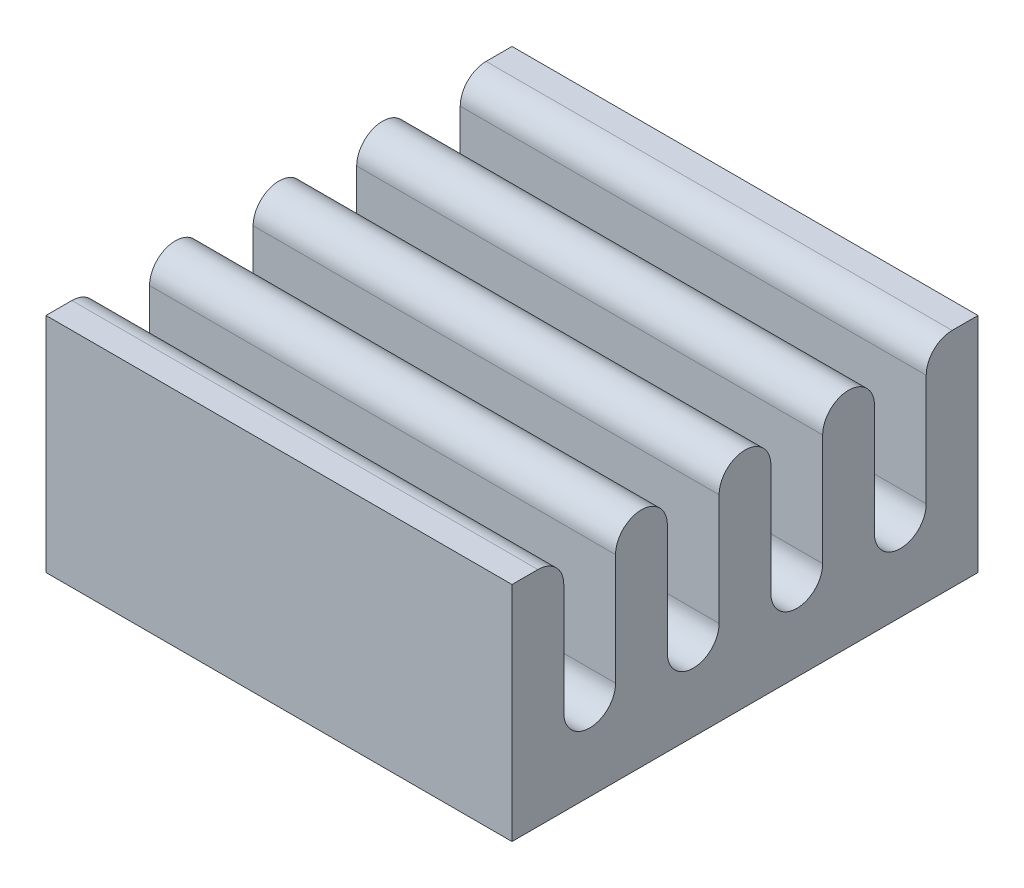
ISO-10303-21;
HEADER;
FILE_DESCRIPTION(('STEP AP214'),'2;1');
FILE_NAME('part.step','',(''),(''),'','','');
FILE_SCHEMA(('AUTOMOTIVE_DESIGN { 1 0 10303 214 1 1 1 1 }'));
ENDSEC;
DATA;
#1=APPLICATION_CONTEXT('core data for automotive mechanical design processes');
#2=APPLICATION_PROTOCOL_DEFINITION('international standard','automotive_design',2000,#1);
#3=PRODUCT_CONTEXT('',#1,'mechanical');
#4=PRODUCT('Part','Part','',(#3));
#5=PRODUCT_RELATED_PRODUCT_CATEGORY('part','',(#4));
#6=PRODUCT_DEFINITION_FORMATION('','',#4);
#7=PRODUCT_DEFINITION_CONTEXT('part definition',#1,'design');
#8=PRODUCT_DEFINITION('design','',#6,#7);
#9=PRODUCT_DEFINITION_SHAPE('','',#8);
#10=(LENGTH_UNIT() NAMED_UNIT(*) SI_UNIT(.MILLI.,.METRE.));
#11=(NAMED_UNIT(*) PLANE_ANGLE_UNIT() SI_UNIT($,.RADIAN.));
#12=(NAMED_UNIT(*) SI_UNIT($,.STERADIAN.) SOLID_ANGLE_UNIT());
#13=UNCERTAINTY_MEASURE_WITH_UNIT(LENGTH_MEASURE(1.E-05),#10,'distance_accuracy_value','');
#14=(GEOMETRIC_REPRESENTATION_CONTEXT(3) GLOBAL_UNCERTAINTY_ASSIGNED_CONTEXT((#13)) GLOBAL_UNIT_ASSIGNED_CONTEXT((#10,
#11,#12)) REPRESENTATION_CONTEXT('',''));
#15=CARTESIAN_POINT('',(0.,0.,0.));
#16=DIRECTION('',(0.,0.,1.));
#17=DIRECTION('',(1.,0.,0.));
#18=AXIS2_PLACEMENT_3D('',#15,#16,#17);
#19=CARTESIAN_POINT('',(-5.40120000000004,5.7,-7.55154555423788));
#20=DIRECTION('',(-1.,0.,0.));
#21=DIRECTION('',(0.,-1.,0.));
#22=AXIS2_PLACEMENT_3D('',#19,#20,#21);
#23=CYLINDRICAL_SURFACE('',#22,0.500000000000003);
#24=CARTESIAN_POINT('',(-4.50000000000004,5.7,-7.55154555423788));
#25=DIRECTION('',(-1.,0.,0.));
#26=DIRECTION('',(0.,-1.,0.));
#27=AXIS2_PLACEMENT_3D('',#24,#25,#26);
#28=CIRCLE('',#27,0.500000000000003);
#29=CARTESIAN_POINT('',(-4.50000000000004,6.2,-7.55154555423788));
#30=VERTEX_POINT('',#29);
#31=CARTESIAN_POINT('',(-4.50000000000004,5.7,-7.05154555423787));
#32=VERTEX_POINT('',#31);
#33=EDGE_CURVE('E172',#30,#32,#28,.F.);
#34=ORIENTED_EDGE('',*,*,#33,.T.);
#35=DIRECTION('',(1.,0.,0.));
#36=VECTOR('',#35,1.);
#37=CARTESIAN_POINT('',(5.40119999999996,5.7,-7.05154555423787));
#38=LINE('',#37,#36);
#39=CARTESIAN_POINT('',(4.49999999999996,5.7,-7.05154555423787));
#40=VERTEX_POINT('',#39);
#41=EDGE_CURVE('E174',#40,#32,#38,.F.);
#42=ORIENTED_EDGE('',*,*,#41,.F.);
#43=CARTESIAN_POINT('',(4.49999999999996,5.7,-7.55154555423788));
#44=DIRECTION('',(-1.,0.,0.));
#45=DIRECTION('',(0.,-1.,0.));
#46=AXIS2_PLACEMENT_3D('',#43,#44,#45);
#47=CIRCLE('',#46,0.500000000000003);
#48=CARTESIAN_POINT('',(4.49999999999996,6.2,-7.55154555423788));
#49=VERTEX_POINT('',#48);
#50=EDGE_CURVE('E20',#40,#49,#47,.T.);
#51=ORIENTED_EDGE('',*,*,#50,.T.);
#52=DIRECTION('',(-1.,0.,0.));
#53=VECTOR('',#52,1.);
#54=CARTESIAN_POINT('',(5.40119999999996,6.2,-7.55154555423787));
#55=LINE('',#54,#53);
#56=EDGE_CURVE('E282',#30,#49,#55,.F.);
#57=ORIENTED_EDGE('',*,*,#56,.F.);
#58=EDGE_LOOP('',(#34,#42,#51,#57));
#59=FACE_BOUND('',#58,.T.);
#60=ADVANCED_FACE('F17',(#59),#23,.T.);
#61=CARTESIAN_POINT('',(0.,3.55000000000001,-6.55154555423787));
#62=DIRECTION('',(1.,0.,0.));
#63=DIRECTION('',(0.,1.,0.));
#64=AXIS2_PLACEMENT_3D('',#61,#62,#63);
#65=CYLINDRICAL_SURFACE('',#64,0.500000000000003);
#66=DIRECTION('',(1.,0.,0.));
#67=VECTOR('',#66,1.);
#68=CARTESIAN_POINT('',(5.40119999999996,3.55000000000001,-7.05154555423787));
#69=LINE('',#68,#67);
#70=CARTESIAN_POINT('',(-4.50000000000004,3.55000000000001,-7.05154555423787));
#71=VERTEX_POINT('',#70);
#72=CARTESIAN_POINT('',(4.49999999999996,3.55000000000001,-7.05154555423787));
#73=VERTEX_POINT('',#72);
#74=EDGE_CURVE('E179',#71,#73,#69,.T.);
#75=ORIENTED_EDGE('',*,*,#74,.F.);
#76=CARTESIAN_POINT('',(-4.50000000000004,3.55000000000001,-6.55154555423787));
#77=DIRECTION('',(1.,0.,0.));
#78=DIRECTION('',(0.,1.,0.));
#79=AXIS2_PLACEMENT_3D('',#76,#77,#78);
#80=CIRCLE('',#79,0.500000000000003);
#81=CARTESIAN_POINT('',(-4.50000000000004,3.55000000000001,-6.05154555423787));
#82=VERTEX_POINT('',#81);
#83=EDGE_CURVE('E332',#82,#71,#80,.T.);
#84=ORIENTED_EDGE('',*,*,#83,.F.);
#85=DIRECTION('',(1.,0.,0.));
#86=VECTOR('',#85,1.);
#87=CARTESIAN_POINT('',(-5.40120000000004,3.55000000000001,-6.05154555423787));
#88=LINE('',#87,#86);
#89=CARTESIAN_POINT('',(4.49999999999996,3.55000000000001,-6.05154555423787));
#90=VERTEX_POINT('',#89);
#91=EDGE_CURVE('E178',#90,#82,#88,.F.);
#92=ORIENTED_EDGE('',*,*,#91,.F.);
#93=CARTESIAN_POINT('',(4.49999999999996,3.55000000000001,-6.55154555423787));
#94=DIRECTION('',(1.,0.,0.));
#95=DIRECTION('',(0.,1.,0.));
#96=AXIS2_PLACEMENT_3D('',#93,#94,#95);
#97=CIRCLE('',#96,0.500000000000003);
#98=EDGE_CURVE('E330',#73,#90,#97,.F.);
#99=ORIENTED_EDGE('',*,*,#98,.F.);
#100=EDGE_LOOP('',(#75,#84,#92,#99));
#101=FACE_BOUND('',#100,.T.);
#102=ADVANCED_FACE('F338',(#101),#65,.F.);
#103=CARTESIAN_POINT('',(-5.40120000000004,5.7,-5.55154555423787));
#104=DIRECTION('',(-1.,0.,0.));
#105=DIRECTION('',(0.,-1.,0.));
#106=AXIS2_PLACEMENT_3D('',#103,#104,#105);
#107=CYLINDRICAL_SURFACE('',#106,0.500000000000007);
#108=CARTESIAN_POINT('',(-4.50000000000004,5.7,-5.55154555423787));
#109=DIRECTION('',(-1.,0.,0.));
#110=DIRECTION('',(0.,-1.,0.));
#111=AXIS2_PLACEMENT_3D('',#108,#109,#110);
#112=CIRCLE('',#111,0.500000000000007);
#113=CARTESIAN_POINT('',(-4.50000000000004,5.7,-6.05154555423787));
#114=VERTEX_POINT('',#113);
#115=CARTESIAN_POINT('',(-4.50000000000004,5.7,-5.05154555423787));
#116=VERTEX_POINT('',#115);
#117=EDGE_CURVE('E326',#114,#116,#112,.F.);
#118=ORIENTED_EDGE('',*,*,#117,.T.);
#119=DIRECTION('',(1.,0.,0.));
#120=VECTOR('',#119,1.);
#121=CARTESIAN_POINT('',(5.40119999999996,5.7,-5.05154555423787));
#122=LINE('',#121,#120);
#123=CARTESIAN_POINT('',(4.49999999999996,5.7,-5.05154555423787));
#124=VERTEX_POINT('',#123);
#125=EDGE_CURVE('E268',#124,#116,#122,.F.);
#126=ORIENTED_EDGE('',*,*,#125,.F.);
#127=CARTESIAN_POINT('',(4.49999999999996,5.7,-5.55154555423787));
#128=DIRECTION('',(-1.,0.,0.));
#129=DIRECTION('',(0.,-1.,0.));
#130=AXIS2_PLACEMENT_3D('',#127,#128,#129);
#131=CIRCLE('',#130,0.500000000000007);
#132=CARTESIAN_POINT('',(4.49999999999996,5.7,-6.05154555423787));
#133=VERTEX_POINT('',#132);
#134=EDGE_CURVE('E328',#124,#133,#131,.T.);
#135=ORIENTED_EDGE('',*,*,#134,.T.);
#136=DIRECTION('',(1.,0.,0.));
#137=VECTOR('',#136,1.);
#138=CARTESIAN_POINT('',(-5.40120000000004,5.7,-6.05154555423787));
#139=LINE('',#138,#137);
#140=EDGE_CURVE('E276',#114,#133,#139,.T.);
#141=ORIENTED_EDGE('',*,*,#140,.F.);
#142=EDGE_LOOP('',(#118,#126,#135,#141));
#143=FACE_BOUND('',#142,.T.);
#144=ADVANCED_FACE('F346',(#143),#107,.T.);
#145=CARTESIAN_POINT('',(0.,3.55000000000001,-4.55154555423787));
#146=DIRECTION('',(1.,0.,0.));
#147=DIRECTION('',(0.,1.,0.));
#148=AXIS2_PLACEMENT_3D('',#145,#146,#147);
#149=CYLINDRICAL_SURFACE('',#148,0.500000000000003);
#150=DIRECTION('',(1.,0.,0.));
#151=VECTOR('',#150,1.);
#152=CARTESIAN_POINT('',(5.40119999999996,3.55000000000001,-5.05154555423787));
#153=LINE('',#152,#151);
#154=CARTESIAN_POINT('',(-4.50000000000004,3.55000000000001,-5.05154555423787));
#155=VERTEX_POINT('',#154);
#156=CARTESIAN_POINT('',(4.49999999999996,3.55000000000001,-5.05154555423787));
#157=VERTEX_POINT('',#156);
#158=EDGE_CURVE('E273',#155,#157,#153,.T.);
#159=ORIENTED_EDGE('',*,*,#158,.F.);
#160=CARTESIAN_POINT('',(-4.50000000000004,3.55000000000001,-4.55154555423787));
#161=DIRECTION('',(1.,0.,0.));
#162=DIRECTION('',(0.,1.,0.));
#163=AXIS2_PLACEMENT_3D('',#160,#161,#162);
#164=CIRCLE('',#163,0.500000000000003);
#165=CARTESIAN_POINT('',(-4.50000000000004,3.55000000000001,-4.05154555423787));
#166=VERTEX_POINT('',#165);
#167=EDGE_CURVE('E324',#166,#155,#164,.T.);
#168=ORIENTED_EDGE('',*,*,#167,.F.);
#169=DIRECTION('',(1.,0.,0.));
#170=VECTOR('',#169,1.);
#171=CARTESIAN_POINT('',(-5.40120000000004,3.55000000000001,-4.05154555423787));
#172=LINE('',#171,#170);
#173=CARTESIAN_POINT('',(4.49999999999996,3.55000000000001,-4.05154555423787));
#174=VERTEX_POINT('',#173);
#175=EDGE_CURVE('E265',#174,#166,#172,.F.);
#176=ORIENTED_EDGE('',*,*,#175,.F.);
#177=CARTESIAN_POINT('',(4.49999999999996,3.55000000000001,-4.55154555423787));
#178=DIRECTION('',(1.,0.,0.));
#179=DIRECTION('',(0.,1.,0.));
#180=AXIS2_PLACEMENT_3D('',#177,#178,#179);
#181=CIRCLE('',#180,0.500000000000003);
#182=EDGE_CURVE('E322',#157,#174,#181,.F.);
#183=ORIENTED_EDGE('',*,*,#182,.F.);
#184=EDGE_LOOP('',(#159,#168,#176,#183));
#185=FACE_BOUND('',#184,.T.);
#186=ADVANCED_FACE('F435',(#185),#149,.F.);
#187=CARTESIAN_POINT('',(-5.40120000000004,5.7,-3.55154555423788));
#188=DIRECTION('',(-1.,0.,0.));
#189=DIRECTION('',(0.,-1.,0.));
#190=AXIS2_PLACEMENT_3D('',#187,#188,#189);
#191=CYLINDRICAL_SURFACE('',#190,0.500000000000003);
#192=CARTESIAN_POINT('',(-4.50000000000004,5.7,-3.55154555423788));
#193=DIRECTION('',(-1.,0.,0.));
#194=DIRECTION('',(0.,-1.,0.));
#195=AXIS2_PLACEMENT_3D('',#192,#193,#194);
#196=CIRCLE('',#195,0.500000000000003);
#197=CARTESIAN_POINT('',(-4.50000000000004,5.7,-4.05154555423787));
#198=VERTEX_POINT('',#197);
#199=CARTESIAN_POINT('',(-4.50000000000004,5.7,-3.05154555423787));
#200=VERTEX_POINT('',#199);
#201=EDGE_CURVE('E318',#198,#200,#196,.F.);
#202=ORIENTED_EDGE('',*,*,#201,.T.);
#203=DIRECTION('',(1.,0.,0.));
#204=VECTOR('',#203,1.);
#205=CARTESIAN_POINT('',(5.40119999999996,5.7,-3.05154555423787));
#206=LINE('',#205,#204);
#207=CARTESIAN_POINT('',(4.49999999999996,5.7,-3.05154555423787));
#208=VERTEX_POINT('',#207);
#209=EDGE_CURVE('E256',#208,#200,#206,.F.);
#210=ORIENTED_EDGE('',*,*,#209,.F.);
#211=CARTESIAN_POINT('',(4.49999999999996,5.7,-3.55154555423788));
#212=DIRECTION('',(-1.,0.,0.));
#213=DIRECTION('',(0.,-1.,0.));
#214=AXIS2_PLACEMENT_3D('',#211,#212,#213);
#215=CIRCLE('',#214,0.500000000000003);
#216=CARTESIAN_POINT('',(4.49999999999996,5.7,-4.05154555423787));
#217=VERTEX_POINT('',#216);
#218=EDGE_CURVE('E320',#208,#217,#215,.T.);
#219=ORIENTED_EDGE('',*,*,#218,.T.);
#220=DIRECTION('',(1.,0.,0.));
#221=VECTOR('',#220,1.);
#222=CARTESIAN_POINT('',(-5.40120000000004,5.7,-4.05154555423787));
#223=LINE('',#222,#221);
#224=EDGE_CURVE('E264',#198,#217,#223,.T.);
#225=ORIENTED_EDGE('',*,*,#224,.F.);
#226=EDGE_LOOP('',(#202,#210,#219,#225));
#227=FACE_BOUND('',#226,.T.);
#228=ADVANCED_FACE('F427',(#227),#191,.T.);
#229=CARTESIAN_POINT('',(0.,3.55000000000001,-2.55154555423789));
#230=DIRECTION('',(1.,0.,0.));
#231=DIRECTION('',(0.,1.,0.));
#232=AXIS2_PLACEMENT_3D('',#229,#230,#231);
#233=CYLINDRICAL_SURFACE('',#232,0.50000000000002);
#234=DIRECTION('',(1.,0.,0.));
#235=VECTOR('',#234,1.);
#236=CARTESIAN_POINT('',(5.40119999999996,3.55000000000001,-3.05154555423787));
#237=LINE('',#236,#235);
#238=CARTESIAN_POINT('',(-4.50000000000004,3.55000000000002,-3.05154555423787));
#239=VERTEX_POINT('',#238);
#240=CARTESIAN_POINT('',(4.49999999999996,3.55,-3.05154555423787));
#241=VERTEX_POINT('',#240);
#242=EDGE_CURVE('E261',#239,#241,#237,.T.);
#243=ORIENTED_EDGE('',*,*,#242,.F.);
#244=CARTESIAN_POINT('',(-4.50000000000004,3.55000000000003,-2.55154555423789));
#245=DIRECTION('',(1.,0.,0.));
#246=DIRECTION('',(0.,1.,0.));
#247=AXIS2_PLACEMENT_3D('',#244,#245,#246);
#248=CIRCLE('',#247,0.50000000000002);
#249=CARTESIAN_POINT('',(-4.50000000000004,3.55000000000002,-2.05154555423787));
#250=VERTEX_POINT('',#249);
#251=EDGE_CURVE('E316',#250,#239,#248,.T.);
#252=ORIENTED_EDGE('',*,*,#251,.F.);
#253=DIRECTION('',(1.,0.,0.));
#254=VECTOR('',#253,1.);
#255=CARTESIAN_POINT('',(-5.40120000000004,3.55000000000001,-2.05154555423787));
#256=LINE('',#255,#254);
#257=CARTESIAN_POINT('',(4.49999999999996,3.55,-2.05154555423787));
#258=VERTEX_POINT('',#257);
#259=EDGE_CURVE('E253',#258,#250,#256,.F.);
#260=ORIENTED_EDGE('',*,*,#259,.F.);
#261=CARTESIAN_POINT('',(4.49999999999996,3.54999999999999,-2.55154555423789));
#262=DIRECTION('',(1.,0.,0.));
#263=DIRECTION('',(0.,1.,0.));
#264=AXIS2_PLACEMENT_3D('',#261,#262,#263);
#265=CIRCLE('',#264,0.50000000000002);
#266=EDGE_CURVE('E314',#241,#258,#265,.F.);
#267=ORIENTED_EDGE('',*,*,#266,.F.);
#268=EDGE_LOOP('',(#243,#252,#260,#267));
#269=FACE_BOUND('',#268,.T.);
#270=ADVANCED_FACE('F421',(#269),#233,.F.);
#271=CARTESIAN_POINT('',(-5.40120000000004,5.7,-1.55154555423787));
#272=DIRECTION('',(-1.,0.,0.));
#273=DIRECTION('',(0.,-1.,0.));
#274=AXIS2_PLACEMENT_3D('',#271,#272,#273);
#275=CYLINDRICAL_SURFACE('',#274,0.499999999999998);
#276=CARTESIAN_POINT('',(-4.50000000000004,5.7,-1.55154555423787));
#277=DIRECTION('',(-1.,0.,0.));
#278=DIRECTION('',(0.,-1.,0.));
#279=AXIS2_PLACEMENT_3D('',#276,#277,#278);
#280=CIRCLE('',#279,0.499999999999998);
#281=CARTESIAN_POINT('',(-4.50000000000004,5.7,-2.05154555423787));
#282=VERTEX_POINT('',#281);
#283=CARTESIAN_POINT('',(-4.50000000000004,5.7,-1.05154555423787));
#284=VERTEX_POINT('',#283);
#285=EDGE_CURVE('E310',#282,#284,#280,.F.);
#286=ORIENTED_EDGE('',*,*,#285,.T.);
#287=DIRECTION('',(1.,0.,0.));
#288=VECTOR('',#287,1.);
#289=CARTESIAN_POINT('',(5.40119999999996,5.7,-1.05154555423787));
#290=LINE('',#289,#288);
#291=CARTESIAN_POINT('',(4.49999999999996,5.7,-1.05154555423787));
#292=VERTEX_POINT('',#291);
#293=EDGE_CURVE('E244',#292,#284,#290,.F.);
#294=ORIENTED_EDGE('',*,*,#293,.F.);
#295=CARTESIAN_POINT('',(4.49999999999996,5.7,-1.55154555423787));
#296=DIRECTION('',(-1.,0.,0.));
#297=DIRECTION('',(0.,-1.,0.));
#298=AXIS2_PLACEMENT_3D('',#295,#296,#297);
#299=CIRCLE('',#298,0.499999999999998);
#300=CARTESIAN_POINT('',(4.49999999999996,5.7,-2.05154555423787));
#301=VERTEX_POINT('',#300);
#302=EDGE_CURVE('E312',#292,#301,#299,.T.);
#303=ORIENTED_EDGE('',*,*,#302,.T.);
#304=DIRECTION('',(1.,0.,0.));
#305=VECTOR('',#304,1.);
#306=CARTESIAN_POINT('',(-5.40120000000004,5.7,-2.05154555423787));
#307=LINE('',#306,#305);
#308=EDGE_CURVE('E252',#282,#301,#307,.T.);
#309=ORIENTED_EDGE('',*,*,#308,.F.);
#310=EDGE_LOOP('',(#286,#294,#303,#309));
#311=FACE_BOUND('',#310,.T.);
#312=ADVANCED_FACE('F412',(#311),#275,.T.);
#313=CARTESIAN_POINT('',(0.,3.55000000000001,-0.551545554237869));
#314=DIRECTION('',(1.,0.,0.));
#315=DIRECTION('',(0.,1.,0.));
#316=AXIS2_PLACEMENT_3D('',#313,#314,#315);
#317=CYLINDRICAL_SURFACE('',#316,0.499999999999998);
#318=DIRECTION('',(1.,0.,0.));
#319=VECTOR('',#318,1.);
#320=CARTESIAN_POINT('',(5.40119999999996,3.55000000000001,-1.05154555423787));
#321=LINE('',#320,#319);
#322=CARTESIAN_POINT('',(-4.50000000000004,3.55000000000001,-1.05154555423787));
#323=VERTEX_POINT('',#322);
#324=CARTESIAN_POINT('',(4.49999999999996,3.55000000000001,-1.05154555423787));
#325=VERTEX_POINT('',#324);
#326=EDGE_CURVE('E249',#323,#325,#321,.T.);
#327=ORIENTED_EDGE('',*,*,#326,.F.);
#328=CARTESIAN_POINT('',(-4.50000000000004,3.55000000000001,-0.551545554237869));
#329=DIRECTION('',(1.,0.,0.));
#330=DIRECTION('',(0.,1.,0.));
#331=AXIS2_PLACEMENT_3D('',#328,#329,#330);
#332=CIRCLE('',#331,0.499999999999998);
#333=CARTESIAN_POINT('',(-4.50000000000004,3.55000000000001,-0.0515455542378707));
#334=VERTEX_POINT('',#333);
#335=EDGE_CURVE('E308',#334,#323,#332,.T.);
#336=ORIENTED_EDGE('',*,*,#335,.F.);
#337=DIRECTION('',(1.,0.,0.));
#338=VECTOR('',#337,1.);
#339=CARTESIAN_POINT('',(-5.40120000000004,3.55000000000001,-0.0515455542378707));
#340=LINE('',#339,#338);
#341=CARTESIAN_POINT('',(4.49999999999996,3.55000000000001,-0.0515455542378709));
#342=VERTEX_POINT('',#341);
#343=EDGE_CURVE('E241',#342,#334,#340,.F.);
#344=ORIENTED_EDGE('',*,*,#343,.F.);
#345=CARTESIAN_POINT('',(4.49999999999996,3.55000000000001,-0.551545554237869));
#346=DIRECTION('',(1.,0.,0.));
#347=DIRECTION('',(0.,1.,0.));
#348=AXIS2_PLACEMENT_3D('',#345,#346,#347);
#349=CIRCLE('',#348,0.499999999999998);
#350=EDGE_CURVE('E306',#325,#342,#349,.F.);
#351=ORIENTED_EDGE('',*,*,#350,.F.);
#352=EDGE_LOOP('',(#327,#336,#344,#351));
#353=FACE_BOUND('',#352,.T.);
#354=ADVANCED_FACE('F404',(#353),#317,.F.);
#355=CARTESIAN_POINT('',(5.40119999999995,5.70000000000001,0.448454445762128));
#356=DIRECTION('',(1.,0.,0.));
#357=DIRECTION('',(0.,1.,0.));
#358=AXIS2_PLACEMENT_3D('',#355,#356,#357);
#359=CYLINDRICAL_SURFACE('',#358,0.499999999999994);
#360=CARTESIAN_POINT('',(4.49999999999996,5.70000000000001,0.448454445762128));
#361=DIRECTION('',(1.,0.,0.));
#362=DIRECTION('',(0.,1.,0.));
#363=AXIS2_PLACEMENT_3D('',#360,#361,#362);
#364=CIRCLE('',#363,0.499999999999994);
#365=CARTESIAN_POINT('',(4.49999999999996,6.2,0.448454445762128));
#366=VERTEX_POINT('',#365);
#367=CARTESIAN_POINT('',(4.49999999999996,5.70000000000001,-0.0515455542378708));
#368=VERTEX_POINT('',#367);
#369=EDGE_CURVE('E284',#366,#368,#364,.F.);
#370=ORIENTED_EDGE('',*,*,#369,.T.);
#371=DIRECTION('',(1.,0.,0.));
#372=VECTOR('',#371,1.);
#373=CARTESIAN_POINT('',(-5.40120000000004,5.7,-0.0515455542378707));
#374=LINE('',#373,#372);
#375=CARTESIAN_POINT('',(-4.50000000000004,5.70000000000001,-0.0515455542378707));
#376=VERTEX_POINT('',#375);
#377=EDGE_CURVE('E230',#376,#368,#374,.T.);
#378=ORIENTED_EDGE('',*,*,#377,.F.);
#379=CARTESIAN_POINT('',(-4.50000000000004,5.70000000000001,0.448454445762128));
#380=DIRECTION('',(1.,0.,0.));
#381=DIRECTION('',(0.,1.,0.));
#382=AXIS2_PLACEMENT_3D('',#379,#380,#381);
#383=CIRCLE('',#382,0.499999999999994);
#384=CARTESIAN_POINT('',(-4.50000000000004,6.2,0.448454445762128));
#385=VERTEX_POINT('',#384);
#386=EDGE_CURVE('E304',#376,#385,#383,.T.);
#387=ORIENTED_EDGE('',*,*,#386,.T.);
#388=DIRECTION('',(-1.,0.,0.));
#389=VECTOR('',#388,1.);
#390=CARTESIAN_POINT('',(5.40119999999996,6.2,0.448454445762128));
#391=LINE('',#390,#389);
#392=EDGE_CURVE('E225',#366,#385,#391,.T.);
#393=ORIENTED_EDGE('',*,*,#392,.F.);
#394=EDGE_LOOP('',(#370,#378,#387,#393));
#395=FACE_BOUND('',#394,.T.);
#396=ADVANCED_FACE('F397',(#395),#359,.T.);
#397=CARTESIAN_POINT('',(5.40119999999996,6.2,-8.70274555423787));
#398=DIRECTION('',(0.,1.,0.));
#399=DIRECTION('',(-1.,0.,0.));
#400=AXIS2_PLACEMENT_3D('',#397,#398,#399);
#401=PLANE('',#400);
#402=DIRECTION('',(0.,0.,1.));
#403=VECTOR('',#402,1.);
#404=CARTESIAN_POINT('',(4.49999999999996,6.2,-8.70274555423787));
#405=LINE('',#404,#403);
#406=CARTESIAN_POINT('',(4.49999999999996,6.2,-8.05154555423787));
#407=VERTEX_POINT('',#406);
#408=EDGE_CURVE('E168',#49,#407,#405,.F.);
#409=ORIENTED_EDGE('',*,*,#408,.T.);
#410=DIRECTION('',(1.,0.,0.));
#411=VECTOR('',#410,1.);
#412=CARTESIAN_POINT('',(-5.40120000000004,6.2,-8.05154555423787));
#413=LINE('',#412,#411);
#414=CARTESIAN_POINT('',(-4.50000000000004,6.2,-8.05154555423787));
#415=VERTEX_POINT('',#414);
#416=EDGE_CURVE('E190',#415,#407,#413,.T.);
#417=ORIENTED_EDGE('',*,*,#416,.F.);
#418=DIRECTION('',(0.,0.,1.));
#419=VECTOR('',#418,1.);
#420=CARTESIAN_POINT('',(-4.50000000000004,6.2,1.84965444576213));
#421=LINE('',#420,#419);
#422=EDGE_CURVE('E194',#30,#415,#421,.F.);
#423=ORIENTED_EDGE('',*,*,#422,.F.);
#424=ORIENTED_EDGE('',*,*,#56,.T.);
#425=EDGE_LOOP('',(#409,#417,#423,#424));
#426=FACE_BOUND('',#425,.T.);
#427=ADVANCED_FACE('F385',(#426),#401,.T.);
#428=CARTESIAN_POINT('',(5.40119999999996,3.33380000000001,-7.05154555423787));
#429=DIRECTION('',(0.,0.,1.));
#430=DIRECTION('',(0.,-1.,0.));
#431=AXIS2_PLACEMENT_3D('',#428,#429,#430);
#432=PLANE('',#431);
#433=ORIENTED_EDGE('',*,*,#41,.T.);
#434=DIRECTION('',(0.,-1.,0.));
#435=VECTOR('',#434,1.);
#436=CARTESIAN_POINT('',(-4.50000000000004,1.24880000000001,-7.05154555423787));
#437=LINE('',#436,#435);
#438=EDGE_CURVE('E197',#71,#32,#437,.F.);
#439=ORIENTED_EDGE('',*,*,#438,.F.);
#440=ORIENTED_EDGE('',*,*,#74,.T.);
#441=DIRECTION('',(0.,1.,0.));
#442=VECTOR('',#441,1.);
#443=CARTESIAN_POINT('',(4.49999999999996,1.24880000000001,-7.05154555423787));
#444=LINE('',#443,#442);
#445=EDGE_CURVE('E166',#40,#73,#444,.F.);
#446=ORIENTED_EDGE('',*,*,#445,.F.);
#447=EDGE_LOOP('',(#433,#439,#440,#446));
#448=FACE_BOUND('',#447,.T.);
#449=ADVANCED_FACE('F182',(#448),#432,.T.);
#450=CARTESIAN_POINT('',(-5.40120000000004,3.33380000000001,-6.05154555423787));
#451=DIRECTION('',(0.,0.,-1.));
#452=DIRECTION('',(0.,1.,0.));
#453=AXIS2_PLACEMENT_3D('',#450,#451,#452);
#454=PLANE('',#453);
#455=ORIENTED_EDGE('',*,*,#140,.T.);
#456=DIRECTION('',(0.,1.,0.));
#457=VECTOR('',#456,1.);
#458=CARTESIAN_POINT('',(4.49999999999996,1.24880000000001,-6.05154555423787));
#459=LINE('',#458,#457);
#460=EDGE_CURVE('E184',#90,#133,#459,.T.);
#461=ORIENTED_EDGE('',*,*,#460,.F.);
#462=ORIENTED_EDGE('',*,*,#91,.T.);
#463=DIRECTION('',(0.,-1.,0.));
#464=VECTOR('',#463,1.);
#465=CARTESIAN_POINT('',(-4.50000000000004,1.24880000000001,-6.05154555423787));
#466=LINE('',#465,#464);
#467=EDGE_CURVE('E201',#114,#82,#466,.T.);
#468=ORIENTED_EDGE('',*,*,#467,.F.);
#469=EDGE_LOOP('',(#455,#461,#462,#468));
#470=FACE_BOUND('',#469,.T.);
#471=ADVANCED_FACE('F343',(#470),#454,.T.);
#472=CARTESIAN_POINT('',(5.40119999999996,3.33380000000001,-5.05154555423787));
#473=DIRECTION('',(0.,0.,1.));
#474=DIRECTION('',(0.,-1.,0.));
#475=AXIS2_PLACEMENT_3D('',#472,#473,#474);
#476=PLANE('',#475);
#477=ORIENTED_EDGE('',*,*,#125,.T.);
#478=DIRECTION('',(0.,-1.,0.));
#479=VECTOR('',#478,1.);
#480=CARTESIAN_POINT('',(-4.50000000000004,1.24880000000001,-5.05154555423787));
#481=LINE('',#480,#479);
#482=EDGE_CURVE('E204',#155,#116,#481,.F.);
#483=ORIENTED_EDGE('',*,*,#482,.F.);
#484=ORIENTED_EDGE('',*,*,#158,.T.);
#485=DIRECTION('',(0.,1.,0.));
#486=VECTOR('',#485,1.);
#487=CARTESIAN_POINT('',(4.49999999999996,1.24880000000001,-5.05154555423787));
#488=LINE('',#487,#486);
#489=EDGE_CURVE('E188',#124,#157,#488,.F.);
#490=ORIENTED_EDGE('',*,*,#489,.F.);
#491=EDGE_LOOP('',(#477,#483,#484,#490));
#492=FACE_BOUND('',#491,.T.);
#493=ADVANCED_FACE('F350',(#492),#476,.T.);
#494=CARTESIAN_POINT('',(-5.40120000000004,3.33380000000001,-4.05154555423787));
#495=DIRECTION('',(0.,0.,-1.));
#496=DIRECTION('',(0.,1.,0.));
#497=AXIS2_PLACEMENT_3D('',#494,#495,#496);
#498=PLANE('',#497);
#499=ORIENTED_EDGE('',*,*,#224,.T.);
#500=DIRECTION('',(0.,1.,0.));
#501=VECTOR('',#500,1.);
#502=CARTESIAN_POINT('',(4.49999999999996,1.24880000000001,-4.05154555423787));
#503=LINE('',#502,#501);
#504=EDGE_CURVE('E352',#174,#217,#503,.T.);
#505=ORIENTED_EDGE('',*,*,#504,.F.);
#506=ORIENTED_EDGE('',*,*,#175,.T.);
#507=DIRECTION('',(0.,-1.,0.));
#508=VECTOR('',#507,1.);
#509=CARTESIAN_POINT('',(-4.50000000000004,1.24880000000001,-4.05154555423787));
#510=LINE('',#509,#508);
#511=EDGE_CURVE('E207',#198,#166,#510,.T.);
#512=ORIENTED_EDGE('',*,*,#511,.F.);
#513=EDGE_LOOP('',(#499,#505,#506,#512));
#514=FACE_BOUND('',#513,.T.);
#515=ADVANCED_FACE('F431',(#514),#498,.T.);
#516=CARTESIAN_POINT('',(5.40119999999996,3.33380000000001,-3.05154555423787));
#517=DIRECTION('',(0.,0.,1.));
#518=DIRECTION('',(0.,-1.,0.));
#519=AXIS2_PLACEMENT_3D('',#516,#517,#518);
#520=PLANE('',#519);
#521=ORIENTED_EDGE('',*,*,#209,.T.);
#522=DIRECTION('',(0.,-1.,0.));
#523=VECTOR('',#522,1.);
#524=CARTESIAN_POINT('',(-4.50000000000004,1.24880000000001,-3.05154555423787));
#525=LINE('',#524,#523);
#526=EDGE_CURVE('E210',#239,#200,#525,.F.);
#527=ORIENTED_EDGE('',*,*,#526,.F.);
#528=ORIENTED_EDGE('',*,*,#242,.T.);
#529=DIRECTION('',(0.,1.,0.));
#530=VECTOR('',#529,1.);
#531=CARTESIAN_POINT('',(4.49999999999996,1.24880000000001,-3.05154555423787));
#532=LINE('',#531,#530);
#533=EDGE_CURVE('E354',#208,#241,#532,.F.);
#534=ORIENTED_EDGE('',*,*,#533,.F.);
#535=EDGE_LOOP('',(#521,#527,#528,#534));
#536=FACE_BOUND('',#535,.T.);
#537=ADVANCED_FACE('F424',(#536),#520,.T.);
#538=CARTESIAN_POINT('',(-5.40120000000004,3.33380000000001,-2.05154555423787));
#539=DIRECTION('',(0.,0.,-1.));
#540=DIRECTION('',(0.,1.,0.));
#541=AXIS2_PLACEMENT_3D('',#538,#539,#540);
#542=PLANE('',#541);
#543=ORIENTED_EDGE('',*,*,#308,.T.);
#544=DIRECTION('',(0.,1.,0.));
#545=VECTOR('',#544,1.);
#546=CARTESIAN_POINT('',(4.49999999999996,1.24880000000001,-2.05154555423787));
#547=LINE('',#546,#545);
#548=EDGE_CURVE('E359',#258,#301,#547,.T.);
#549=ORIENTED_EDGE('',*,*,#548,.F.);
#550=ORIENTED_EDGE('',*,*,#259,.T.);
#551=DIRECTION('',(0.,-1.,0.));
#552=VECTOR('',#551,1.);
#553=CARTESIAN_POINT('',(-4.50000000000004,1.24880000000001,-2.05154555423787));
#554=LINE('',#553,#552);
#555=EDGE_CURVE('E213',#282,#250,#554,.T.);
#556=ORIENTED_EDGE('',*,*,#555,.F.);
#557=EDGE_LOOP('',(#543,#549,#550,#556));
#558=FACE_BOUND('',#557,.T.);
#559=ADVANCED_FACE('F416',(#558),#542,.T.);
#560=CARTESIAN_POINT('',(5.40119999999996,3.33380000000001,-1.05154555423787));
#561=DIRECTION('',(0.,0.,1.));
#562=DIRECTION('',(0.,-1.,0.));
#563=AXIS2_PLACEMENT_3D('',#560,#561,#562);
#564=PLANE('',#563);
#565=ORIENTED_EDGE('',*,*,#293,.T.);
#566=DIRECTION('',(0.,-1.,0.));
#567=VECTOR('',#566,1.);
#568=CARTESIAN_POINT('',(-4.50000000000004,1.24880000000001,-1.05154555423787));
#569=LINE('',#568,#567);
#570=EDGE_CURVE('E216',#323,#284,#569,.F.);
#571=ORIENTED_EDGE('',*,*,#570,.F.);
#572=ORIENTED_EDGE('',*,*,#326,.T.);
#573=DIRECTION('',(0.,1.,0.));
#574=VECTOR('',#573,1.);
#575=CARTESIAN_POINT('',(4.49999999999996,1.24880000000001,-1.05154555423787));
#576=LINE('',#575,#574);
#577=EDGE_CURVE('E362',#292,#325,#576,.F.);
#578=ORIENTED_EDGE('',*,*,#577,.F.);
#579=EDGE_LOOP('',(#565,#571,#572,#578));
#580=FACE_BOUND('',#579,.T.);
#581=ADVANCED_FACE('F408',(#580),#564,.T.);
#582=CARTESIAN_POINT('',(-5.40120000000004,3.33380000000001,-0.0515455542378707));
#583=DIRECTION('',(0.,0.,-1.));
#584=DIRECTION('',(0.,1.,0.));
#585=AXIS2_PLACEMENT_3D('',#582,#583,#584);
#586=PLANE('',#585);
#587=ORIENTED_EDGE('',*,*,#377,.T.);
#588=DIRECTION('',(0.,1.,0.));
#589=VECTOR('',#588,1.);
#590=CARTESIAN_POINT('',(4.49999999999996,1.24880000000001,-0.0515455542378709));
#591=LINE('',#590,#589);
#592=EDGE_CURVE('E365',#342,#368,#591,.T.);
#593=ORIENTED_EDGE('',*,*,#592,.F.);
#594=ORIENTED_EDGE('',*,*,#343,.T.);
#595=DIRECTION('',(0.,-1.,0.));
#596=VECTOR('',#595,1.);
#597=CARTESIAN_POINT('',(-4.50000000000004,1.24880000000001,-0.0515455542378707));
#598=LINE('',#597,#596);
#599=EDGE_CURVE('E219',#376,#334,#598,.T.);
#600=ORIENTED_EDGE('',*,*,#599,.F.);
#601=EDGE_LOOP('',(#587,#593,#594,#600));
#602=FACE_BOUND('',#601,.T.);
#603=ADVANCED_FACE('F400',(#602),#586,.T.);
#604=CARTESIAN_POINT('',(5.40119999999996,6.2,-0.202745554237871));
#605=DIRECTION('',(0.,1.,0.));
#606=DIRECTION('',(-1.,0.,0.));
#607=AXIS2_PLACEMENT_3D('',#604,#605,#606);
#608=PLANE('',#607);
#609=DIRECTION('',(0.,0.,1.));
#610=VECTOR('',#609,1.);
#611=CARTESIAN_POINT('',(-4.50000000000004,6.2,1.84965444576213));
#612=LINE('',#611,#610);
#613=CARTESIAN_POINT('',(-4.50000000000004,6.2,0.94845444576213));
#614=VERTEX_POINT('',#613);
#615=EDGE_CURVE('E222',#614,#385,#612,.F.);
#616=ORIENTED_EDGE('',*,*,#615,.F.);
#617=DIRECTION('',(1.,0.,0.));
#618=VECTOR('',#617,1.);
#619=CARTESIAN_POINT('',(5.40119999999996,6.2,0.94845444576213));
#620=LINE('',#619,#618);
#621=CARTESIAN_POINT('',(4.49999999999996,6.2,0.94845444576213));
#622=VERTEX_POINT('',#621);
#623=EDGE_CURVE('E231',#622,#614,#620,.F.);
#624=ORIENTED_EDGE('',*,*,#623,.F.);
#625=DIRECTION('',(0.,0.,1.));
#626=VECTOR('',#625,1.);
#627=CARTESIAN_POINT('',(4.49999999999996,6.2,-8.95274555423787));
#628=LINE('',#627,#626);
#629=EDGE_CURVE('E238',#366,#622,#628,.T.);
#630=ORIENTED_EDGE('',*,*,#629,.F.);
#631=ORIENTED_EDGE('',*,*,#392,.T.);
#632=EDGE_LOOP('',(#616,#624,#630,#631));
#633=FACE_BOUND('',#632,.T.);
#634=ADVANCED_FACE('F392',(#633),#608,.T.);
#635=CARTESIAN_POINT('',(-4.50000000000004,1.24880000000001,1.84965444576213));
#636=DIRECTION('',(-1.,0.,0.));
#637=DIRECTION('',(0.,-1.,0.));
#638=AXIS2_PLACEMENT_3D('',#635,#636,#637);
#639=PLANE('',#638);
#640=DIRECTION('',(0.,1.,0.));
#641=VECTOR('',#640,1.);
#642=CARTESIAN_POINT('',(-4.50000000000004,1.24880000000001,-8.05154555423787));
#643=LINE('',#642,#641);
#644=CARTESIAN_POINT('',(-4.50000000000004,1.90000000000001,-8.05154555423787));
#645=VERTEX_POINT('',#644);
#646=EDGE_CURVE('E196',#645,#415,#643,.T.);
#647=ORIENTED_EDGE('',*,*,#646,.F.);
#648=DIRECTION('',(0.,0.,1.));
#649=VECTOR('',#648,1.);
#650=CARTESIAN_POINT('',(-4.50000000000004,1.90000000000001,-8.20154555423787));
#651=LINE('',#650,#649);
#652=CARTESIAN_POINT('',(-4.50000000000004,1.90000000000001,0.94845444576213));
#653=VERTEX_POINT('',#652);
#654=EDGE_CURVE('E295',#653,#645,#651,.F.);
#655=ORIENTED_EDGE('',*,*,#654,.F.);
#656=DIRECTION('',(0.,-1.,0.));
#657=VECTOR('',#656,1.);
#658=CARTESIAN_POINT('',(-4.50000000000004,1.24880000000001,0.94845444576213));
#659=LINE('',#658,#657);
#660=EDGE_CURVE('E234',#614,#653,#659,.T.);
#661=ORIENTED_EDGE('',*,*,#660,.F.);
#662=ORIENTED_EDGE('',*,*,#615,.T.);
#663=ORIENTED_EDGE('',*,*,#386,.F.);
#664=ORIENTED_EDGE('',*,*,#599,.T.);
#665=ORIENTED_EDGE('',*,*,#335,.T.);
#666=ORIENTED_EDGE('',*,*,#570,.T.);
#667=ORIENTED_EDGE('',*,*,#285,.F.);
#668=ORIENTED_EDGE('',*,*,#555,.T.);
#669=ORIENTED_EDGE('',*,*,#251,.T.);
#670=ORIENTED_EDGE('',*,*,#526,.T.);
#671=ORIENTED_EDGE('',*,*,#201,.F.);
#672=ORIENTED_EDGE('',*,*,#511,.T.);
#673=ORIENTED_EDGE('',*,*,#167,.T.);
#674=ORIENTED_EDGE('',*,*,#482,.T.);
#675=ORIENTED_EDGE('',*,*,#117,.F.);
#676=ORIENTED_EDGE('',*,*,#467,.T.);
#677=ORIENTED_EDGE('',*,*,#83,.T.);
#678=ORIENTED_EDGE('',*,*,#438,.T.);
#679=ORIENTED_EDGE('',*,*,#33,.F.);
#680=ORIENTED_EDGE('',*,*,#422,.T.);
#681=EDGE_LOOP('',(#647,#655,#661,#662,#663,#664,#665,#666,#667,#668,#669,#670,#671,#672,#673,
#674,#675,#676,#677,#678,#679,#680));
#682=FACE_BOUND('',#681,.T.);
#683=ADVANCED_FACE('F334',(#682),#639,.T.);
#684=CARTESIAN_POINT('',(-5.40120000000004,1.24880000000001,-8.05154555423787));
#685=DIRECTION('',(0.,0.,-1.));
#686=DIRECTION('',(0.,1.,0.));
#687=AXIS2_PLACEMENT_3D('',#684,#685,#686);
#688=PLANE('',#687);
#689=DIRECTION('',(0.,1.,0.));
#690=VECTOR('',#689,1.);
#691=CARTESIAN_POINT('',(4.49999999999996,1.24880000000001,-8.05154555423787));
#692=LINE('',#691,#690);
#693=CARTESIAN_POINT('',(4.49999999999996,1.90000000000001,-8.05154555423787));
#694=VERTEX_POINT('',#693);
#695=EDGE_CURVE('E185',#694,#407,#692,.T.);
#696=ORIENTED_EDGE('',*,*,#695,.F.);
#697=DIRECTION('',(1.,0.,0.));
#698=VECTOR('',#697,1.);
#699=CARTESIAN_POINT('',(5.55999999999996,1.90000000000001,-8.05154555423787));
#700=LINE('',#699,#698);
#701=EDGE_CURVE('E373',#645,#694,#700,.T.);
#702=ORIENTED_EDGE('',*,*,#701,.F.);
#703=ORIENTED_EDGE('',*,*,#646,.T.);
#704=ORIENTED_EDGE('',*,*,#416,.T.);
#705=EDGE_LOOP('',(#696,#702,#703,#704));
#706=FACE_BOUND('',#705,.T.);
#707=ADVANCED_FACE('F381',(#706),#688,.T.);
#708=CARTESIAN_POINT('',(4.49999999999996,1.24880000000001,-8.95274555423787));
#709=DIRECTION('',(1.,0.,0.));
#710=DIRECTION('',(0.,1.,0.));
#711=AXIS2_PLACEMENT_3D('',#708,#709,#710);
#712=PLANE('',#711);
#713=DIRECTION('',(0.,-1.,0.));
#714=VECTOR('',#713,1.);
#715=CARTESIAN_POINT('',(4.49999999999996,1.24880000000001,0.94845444576213));
#716=LINE('',#715,#714);
#717=CARTESIAN_POINT('',(4.49999999999996,1.90000000000001,0.94845444576213));
#718=VERTEX_POINT('',#717);
#719=EDGE_CURVE('E35',#718,#622,#716,.F.);
#720=ORIENTED_EDGE('',*,*,#719,.F.);
#721=DIRECTION('',(0.,0.,1.));
#722=VECTOR('',#721,1.);
#723=CARTESIAN_POINT('',(4.49999999999996,1.90000000000001,-8.20154555423787));
#724=LINE('',#723,#722);
#725=EDGE_CURVE('E26',#694,#718,#724,.T.);
#726=ORIENTED_EDGE('',*,*,#725,.F.);
#727=ORIENTED_EDGE('',*,*,#695,.T.);
#728=ORIENTED_EDGE('',*,*,#408,.F.);
#729=ORIENTED_EDGE('',*,*,#50,.F.);
#730=ORIENTED_EDGE('',*,*,#445,.T.);
#731=ORIENTED_EDGE('',*,*,#98,.T.);
#732=ORIENTED_EDGE('',*,*,#460,.T.);
#733=ORIENTED_EDGE('',*,*,#134,.F.);
#734=ORIENTED_EDGE('',*,*,#489,.T.);
#735=ORIENTED_EDGE('',*,*,#182,.T.);
#736=ORIENTED_EDGE('',*,*,#504,.T.);
#737=ORIENTED_EDGE('',*,*,#218,.F.);
#738=ORIENTED_EDGE('',*,*,#533,.T.);
#739=ORIENTED_EDGE('',*,*,#266,.T.);
#740=ORIENTED_EDGE('',*,*,#548,.T.);
#741=ORIENTED_EDGE('',*,*,#302,.F.);
#742=ORIENTED_EDGE('',*,*,#577,.T.);
#743=ORIENTED_EDGE('',*,*,#350,.T.);
#744=ORIENTED_EDGE('',*,*,#592,.T.);
#745=ORIENTED_EDGE('',*,*,#369,.F.);
#746=ORIENTED_EDGE('',*,*,#629,.T.);
#747=EDGE_LOOP('',(#720,#726,#727,#728,#729,#730,#731,#732,#733,#734,#735,#736,#737,#738,#739,
#740,#741,#742,#743,#744,#745,#746));
#748=FACE_BOUND('',#747,.T.);
#749=ADVANCED_FACE('F164',(#748),#712,.T.);
#750=CARTESIAN_POINT('',(5.40119999999996,1.24880000000001,0.94845444576213));
#751=DIRECTION('',(0.,0.,1.));
#752=DIRECTION('',(0.,-1.,0.));
#753=AXIS2_PLACEMENT_3D('',#750,#751,#752);
#754=PLANE('',#753);
#755=ORIENTED_EDGE('',*,*,#660,.T.);
#756=DIRECTION('',(1.,0.,0.));
#757=VECTOR('',#756,1.);
#758=CARTESIAN_POINT('',(5.55999999999996,1.90000000000001,0.94845444576213));
#759=LINE('',#758,#757);
#760=EDGE_CURVE('E11',#718,#653,#759,.F.);
#761=ORIENTED_EDGE('',*,*,#760,.F.);
#762=ORIENTED_EDGE('',*,*,#719,.T.);
#763=ORIENTED_EDGE('',*,*,#623,.T.);
#764=EDGE_LOOP('',(#755,#761,#762,#763));
#765=FACE_BOUND('',#764,.T.);
#766=ADVANCED_FACE('F388',(#765),#754,.T.);
#767=CARTESIAN_POINT('',(5.55999999999996,1.90000000000001,-8.20154555423787));
#768=DIRECTION('',(0.,-1.,0.));
#769=DIRECTION('',(1.,0.,0.));
#770=AXIS2_PLACEMENT_3D('',#767,#768,#769);
#771=PLANE('',#770);
#772=ORIENTED_EDGE('',*,*,#725,.T.);
#773=ORIENTED_EDGE('',*,*,#760,.T.);
#774=ORIENTED_EDGE('',*,*,#654,.T.);
#775=ORIENTED_EDGE('',*,*,#701,.T.);
#776=EDGE_LOOP('',(#772,#773,#774,#775));
#777=FACE_BOUND('',#776,.T.);
#778=ADVANCED_FACE('F378',(#777),#771,.T.);
#779=CLOSED_SHELL('',(#60,#102,#144,#186,#228,#270,#312,#354,#396,#427,#449,#471,#493,#515,#537,
#559,#581,#603,#634,#683,#707,#749,#766,#778));
#780=MANIFOLD_SOLID_BREP('B1',#779);
#781=ADVANCED_BREP_SHAPE_REPRESENTATION('',(#18,#780),#14);
#782=SHAPE_DEFINITION_REPRESENTATION(#9,#781);
ENDSEC;
END-ISO-10303-21;
